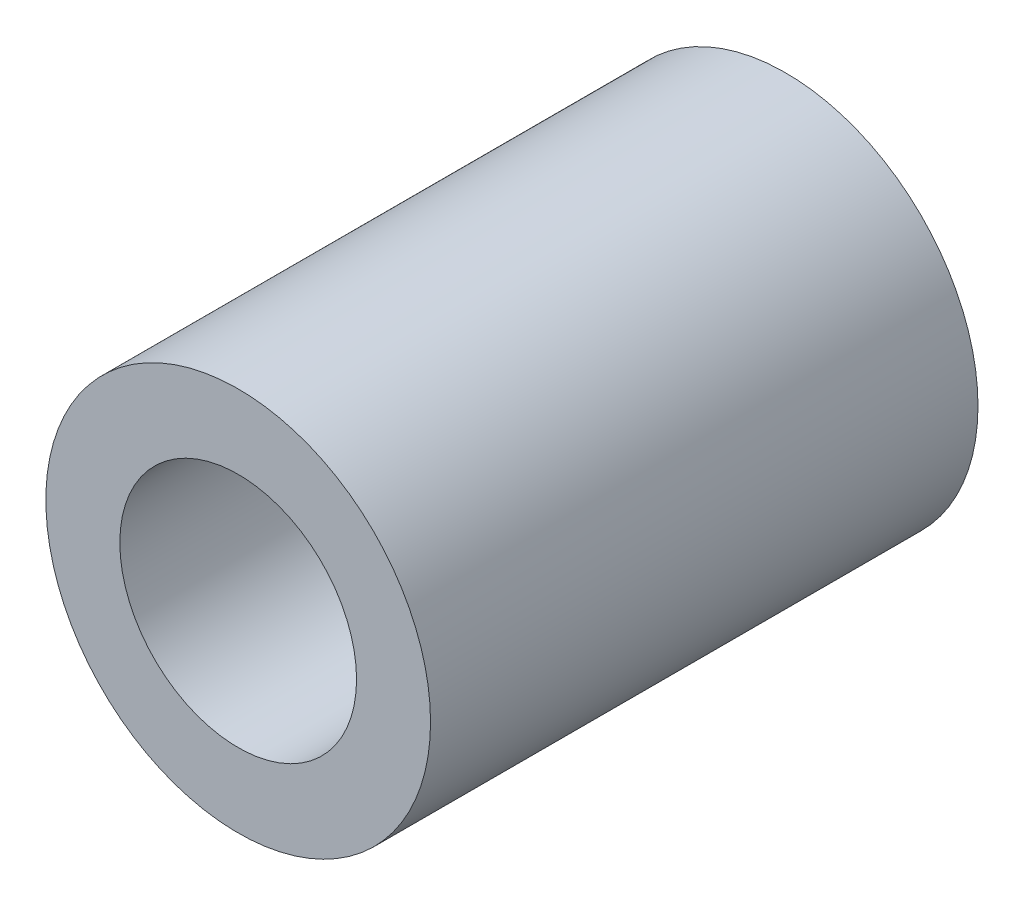
ISO-10303-21;
HEADER;
FILE_DESCRIPTION(('STEP AP214'),'2;1');
FILE_NAME('part.step','',(''),(''),'','','');
FILE_SCHEMA(('AUTOMOTIVE_DESIGN { 1 0 10303 214 1 1 1 1 }'));
ENDSEC;
DATA;
#1=APPLICATION_CONTEXT('core data for automotive mechanical design processes');
#2=APPLICATION_PROTOCOL_DEFINITION('international standard','automotive_design',2000,#1);
#3=PRODUCT_CONTEXT('',#1,'mechanical');
#4=PRODUCT('Part','Part','',(#3));
#5=PRODUCT_RELATED_PRODUCT_CATEGORY('part','',(#4));
#6=PRODUCT_DEFINITION_FORMATION('','',#4);
#7=PRODUCT_DEFINITION_CONTEXT('part definition',#1,'design');
#8=PRODUCT_DEFINITION('design','',#6,#7);
#9=PRODUCT_DEFINITION_SHAPE('','',#8);
#10=(LENGTH_UNIT() NAMED_UNIT(*) SI_UNIT(.MILLI.,.METRE.));
#11=(NAMED_UNIT(*) PLANE_ANGLE_UNIT() SI_UNIT($,.RADIAN.));
#12=(NAMED_UNIT(*) SI_UNIT($,.STERADIAN.) SOLID_ANGLE_UNIT());
#13=UNCERTAINTY_MEASURE_WITH_UNIT(LENGTH_MEASURE(1.E-05),#10,'distance_accuracy_value','');
#14=(GEOMETRIC_REPRESENTATION_CONTEXT(3) GLOBAL_UNCERTAINTY_ASSIGNED_CONTEXT((#13)) GLOBAL_UNIT_ASSIGNED_CONTEXT((#10,
#11,#12)) REPRESENTATION_CONTEXT('',''));
#15=CARTESIAN_POINT('',(0.,0.,0.));
#16=DIRECTION('',(0.,0.,1.));
#17=DIRECTION('',(1.,0.,0.));
#18=AXIS2_PLACEMENT_3D('',#15,#16,#17);
#19=CARTESIAN_POINT('',(-10.,10.,13.));
#20=DIRECTION('',(0.,0.,1.));
#21=DIRECTION('',(1.,0.,0.));
#22=AXIS2_PLACEMENT_3D('',#19,#20,#21);
#23=PLANE('',#22);
#24=CARTESIAN_POINT('',(-10.,10.,13.));
#25=DIRECTION('',(0.,0.,1.));
#26=DIRECTION('',(1.,0.,0.));
#27=AXIS2_PLACEMENT_3D('',#24,#25,#26);
#28=CIRCLE('',#27,1.6);
#29=CARTESIAN_POINT('',(-8.4,10.,13.));
#30=VERTEX_POINT('',#29);
#31=EDGE_CURVE('E24',#30,#30,#28,.T.);
#32=ORIENTED_EDGE('',*,*,#31,.F.);
#33=EDGE_LOOP('',(#32));
#34=FACE_BOUND('',#33,.T.);
#35=CARTESIAN_POINT('',(-10.,10.,13.));
#36=DIRECTION('',(0.,0.,1.));
#37=DIRECTION('',(1.,0.,0.));
#38=AXIS2_PLACEMENT_3D('',#35,#36,#37);
#39=CIRCLE('',#38,2.6);
#40=CARTESIAN_POINT('',(-7.4,10.,13.));
#41=VERTEX_POINT('',#40);
#42=EDGE_CURVE('E59',#41,#41,#39,.T.);
#43=ORIENTED_EDGE('',*,*,#42,.T.);
#44=EDGE_LOOP('',(#43));
#45=FACE_BOUND('',#44,.T.);
#46=ADVANCED_FACE('F15',(#34,#45),#23,.T.);
#47=CARTESIAN_POINT('',(-10.,10.,5.6));
#48=DIRECTION('',(0.,0.,1.));
#49=DIRECTION('',(1.,0.,0.));
#50=AXIS2_PLACEMENT_3D('',#47,#48,#49);
#51=PLANE('',#50);
#52=CARTESIAN_POINT('',(-10.,10.,5.6));
#53=DIRECTION('',(0.,0.,1.));
#54=DIRECTION('',(1.,0.,0.));
#55=AXIS2_PLACEMENT_3D('',#52,#53,#54);
#56=CIRCLE('',#55,1.6);
#57=CARTESIAN_POINT('',(-8.4,10.,5.6));
#58=VERTEX_POINT('',#57);
#59=EDGE_CURVE('E9',#58,#58,#56,.T.);
#60=ORIENTED_EDGE('',*,*,#59,.T.);
#61=EDGE_LOOP('',(#60));
#62=FACE_BOUND('',#61,.T.);
#63=CARTESIAN_POINT('',(-10.,10.,5.6));
#64=DIRECTION('',(0.,0.,1.));
#65=DIRECTION('',(1.,0.,0.));
#66=AXIS2_PLACEMENT_3D('',#63,#64,#65);
#67=CIRCLE('',#66,2.6);
#68=CARTESIAN_POINT('',(-7.4,10.,5.6));
#69=VERTEX_POINT('',#68);
#70=EDGE_CURVE('E60',#69,#69,#67,.T.);
#71=ORIENTED_EDGE('',*,*,#70,.F.);
#72=EDGE_LOOP('',(#71));
#73=FACE_BOUND('',#72,.T.);
#74=ADVANCED_FACE('F73',(#62,#73),#51,.F.);
#75=CARTESIAN_POINT('',(-10.,10.,5.6));
#76=DIRECTION('',(0.,0.,-1.));
#77=DIRECTION('',(1.,0.,0.));
#78=AXIS2_PLACEMENT_3D('',#75,#76,#77);
#79=CYLINDRICAL_SURFACE('',#78,1.6);
#80=DIRECTION('',(0.,0.,1.));
#81=VECTOR('',#80,1.);
#82=CARTESIAN_POINT('',(-8.4,10.,5.6));
#83=LINE('',#82,#81);
#84=EDGE_CURVE('E18',#58,#30,#83,.T.);
#85=ORIENTED_EDGE('',*,*,#84,.T.);
#86=ORIENTED_EDGE('',*,*,#31,.T.);
#87=ORIENTED_EDGE('',*,*,#84,.F.);
#88=ORIENTED_EDGE('',*,*,#59,.F.);
#89=EDGE_LOOP('',(#85,#86,#87,#88));
#90=FACE_BOUND('',#89,.T.);
#91=ADVANCED_FACE('F75',(#90),#79,.F.);
#92=CARTESIAN_POINT('',(-10.,10.,5.6));
#93=DIRECTION('',(0.,0.,-1.));
#94=DIRECTION('',(1.,0.,0.));
#95=AXIS2_PLACEMENT_3D('',#92,#93,#94);
#96=CYLINDRICAL_SURFACE('',#95,2.6);
#97=ORIENTED_EDGE('',*,*,#70,.T.);
#98=DIRECTION('',(0.,0.,1.));
#99=VECTOR('',#98,1.);
#100=CARTESIAN_POINT('',(-7.4,10.,5.6));
#101=LINE('',#100,#99);
#102=EDGE_CURVE('E53',#69,#41,#101,.T.);
#103=ORIENTED_EDGE('',*,*,#102,.T.);
#104=ORIENTED_EDGE('',*,*,#42,.F.);
#105=ORIENTED_EDGE('',*,*,#102,.F.);
#106=EDGE_LOOP('',(#97,#103,#104,#105));
#107=FACE_BOUND('',#106,.T.);
#108=ADVANCED_FACE('F54',(#107),#96,.T.);
#109=CLOSED_SHELL('',(#46,#74,#91,#108));
#110=MANIFOLD_SOLID_BREP('B1',#109);
#111=ADVANCED_BREP_SHAPE_REPRESENTATION('',(#18,#110),#14);
#112=SHAPE_DEFINITION_REPRESENTATION(#9,#111);
ENDSEC;
END-ISO-10303-21;
